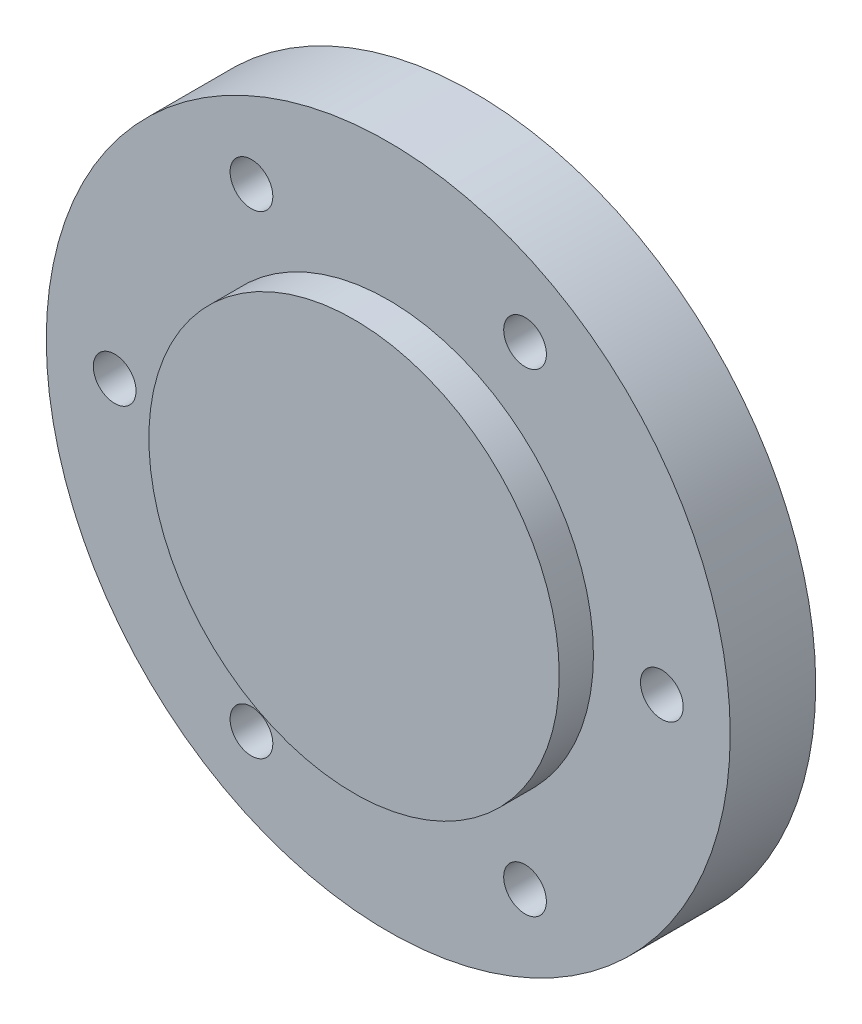
ISO-10303-21;
HEADER;
FILE_DESCRIPTION(('STEP AP214'),'2;1');
FILE_NAME('part.step','',(''),(''),'','','');
FILE_SCHEMA(('AUTOMOTIVE_DESIGN { 1 0 10303 214 1 1 1 1 }'));
ENDSEC;
DATA;
#1=APPLICATION_CONTEXT('core data for automotive mechanical design processes');
#2=APPLICATION_PROTOCOL_DEFINITION('international standard','automotive_design',2000,#1);
#3=PRODUCT_CONTEXT('',#1,'mechanical');
#4=PRODUCT('Part','Part','',(#3));
#5=PRODUCT_RELATED_PRODUCT_CATEGORY('part','',(#4));
#6=PRODUCT_DEFINITION_FORMATION('','',#4);
#7=PRODUCT_DEFINITION_CONTEXT('part definition',#1,'design');
#8=PRODUCT_DEFINITION('design','',#6,#7);
#9=PRODUCT_DEFINITION_SHAPE('','',#8);
#10=(LENGTH_UNIT() NAMED_UNIT(*) SI_UNIT(.MILLI.,.METRE.));
#11=(NAMED_UNIT(*) PLANE_ANGLE_UNIT() SI_UNIT($,.RADIAN.));
#12=(NAMED_UNIT(*) SI_UNIT($,.STERADIAN.) SOLID_ANGLE_UNIT());
#13=UNCERTAINTY_MEASURE_WITH_UNIT(LENGTH_MEASURE(1.E-05),#10,'distance_accuracy_value','');
#14=(GEOMETRIC_REPRESENTATION_CONTEXT(3) GLOBAL_UNCERTAINTY_ASSIGNED_CONTEXT((#13)) GLOBAL_UNIT_ASSIGNED_CONTEXT((#10,
#11,#12)) REPRESENTATION_CONTEXT('',''));
#15=CARTESIAN_POINT('',(0.,0.,0.));
#16=DIRECTION('',(0.,0.,1.));
#17=DIRECTION('',(1.,0.,0.));
#18=AXIS2_PLACEMENT_3D('',#15,#16,#17);
#19=CARTESIAN_POINT('',(0.,0.,5.));
#20=DIRECTION('',(0.,0.,-1.));
#21=DIRECTION('',(-1.,0.,0.));
#22=AXIS2_PLACEMENT_3D('',#19,#20,#21);
#23=CYLINDRICAL_SURFACE('',#22,20.);
#24=CARTESIAN_POINT('',(0.,0.,5.));
#25=DIRECTION('',(0.,0.,1.));
#26=DIRECTION('',(1.,0.,0.));
#27=AXIS2_PLACEMENT_3D('',#24,#25,#26);
#28=CIRCLE('',#27,20.);
#29=CARTESIAN_POINT('',(20.,0.,5.));
#30=VERTEX_POINT('',#29);
#31=EDGE_CURVE('E42',#30,#30,#28,.T.);
#32=ORIENTED_EDGE('',*,*,#31,.F.);
#33=EDGE_LOOP('',(#32));
#34=FACE_BOUND('',#33,.T.);
#35=CARTESIAN_POINT('',(0.,0.,0.));
#36=DIRECTION('',(0.,0.,1.));
#37=DIRECTION('',(1.,0.,0.));
#38=AXIS2_PLACEMENT_3D('',#35,#36,#37);
#39=CIRCLE('',#38,20.);
#40=CARTESIAN_POINT('',(20.,0.,0.));
#41=VERTEX_POINT('',#40);
#42=EDGE_CURVE('E37',#41,#41,#39,.T.);
#43=ORIENTED_EDGE('',*,*,#42,.T.);
#44=EDGE_LOOP('',(#43));
#45=FACE_BOUND('',#44,.T.);
#46=ADVANCED_FACE('F40',(#34,#45),#23,.T.);
#47=CARTESIAN_POINT('',(0.,0.,5.));
#48=DIRECTION('',(0.,0.,1.));
#49=DIRECTION('',(1.,0.,0.));
#50=AXIS2_PLACEMENT_3D('',#47,#48,#49);
#51=PLANE('',#50);
#52=CARTESIAN_POINT('',(7.99999999999999,-13.856406460551,5.));
#53=DIRECTION('',(0.,0.,1.));
#54=DIRECTION('',(0.499999999999999,-0.866025403784439,0.));
#55=AXIS2_PLACEMENT_3D('',#52,#53,#54);
#56=CIRCLE('',#55,1.25);
#57=CARTESIAN_POINT('',(8.62499999999999,-14.9389382152816,5.));
#58=VERTEX_POINT('',#57);
#59=EDGE_CURVE('E66',#58,#58,#56,.T.);
#60=ORIENTED_EDGE('',*,*,#59,.F.);
#61=EDGE_LOOP('',(#60));
#62=FACE_BOUND('',#61,.T.);
#63=CARTESIAN_POINT('',(-8.00000000000001,-13.856406460551,5.));
#64=DIRECTION('',(0.,0.,1.));
#65=DIRECTION('',(-0.5,-0.866025403784438,0.));
#66=AXIS2_PLACEMENT_3D('',#63,#64,#65);
#67=CIRCLE('',#66,1.25);
#68=CARTESIAN_POINT('',(-8.62500000000001,-14.9389382152816,5.));
#69=VERTEX_POINT('',#68);
#70=EDGE_CURVE('E75',#69,#69,#67,.T.);
#71=ORIENTED_EDGE('',*,*,#70,.F.);
#72=EDGE_LOOP('',(#71));
#73=FACE_BOUND('',#72,.T.);
#74=CARTESIAN_POINT('',(-16.,0.,5.));
#75=DIRECTION('',(0.,0.,1.));
#76=DIRECTION('',(-1.,0.,0.));
#77=AXIS2_PLACEMENT_3D('',#74,#75,#76);
#78=CIRCLE('',#77,1.25);
#79=CARTESIAN_POINT('',(-17.25,0.,5.));
#80=VERTEX_POINT('',#79);
#81=EDGE_CURVE('E80',#80,#80,#78,.T.);
#82=ORIENTED_EDGE('',*,*,#81,.F.);
#83=EDGE_LOOP('',(#82));
#84=FACE_BOUND('',#83,.T.);
#85=CARTESIAN_POINT('',(-8.,13.856406460551,5.));
#86=DIRECTION('',(0.,0.,1.));
#87=DIRECTION('',(-0.5,0.866025403784439,0.));
#88=AXIS2_PLACEMENT_3D('',#85,#86,#87);
#89=CIRCLE('',#88,1.25);
#90=CARTESIAN_POINT('',(-8.625,14.9389382152816,5.));
#91=VERTEX_POINT('',#90);
#92=EDGE_CURVE('E83',#91,#91,#89,.T.);
#93=ORIENTED_EDGE('',*,*,#92,.F.);
#94=EDGE_LOOP('',(#93));
#95=FACE_BOUND('',#94,.T.);
#96=CARTESIAN_POINT('',(8.,13.856406460551,5.));
#97=DIRECTION('',(0.,0.,1.));
#98=DIRECTION('',(0.5,0.866025403784439,0.));
#99=AXIS2_PLACEMENT_3D('',#96,#97,#98);
#100=CIRCLE('',#99,1.25);
#101=CARTESIAN_POINT('',(8.625,14.9389382152816,5.));
#102=VERTEX_POINT('',#101);
#103=EDGE_CURVE('E58',#102,#102,#100,.T.);
#104=ORIENTED_EDGE('',*,*,#103,.F.);
#105=EDGE_LOOP('',(#104));
#106=FACE_BOUND('',#105,.T.);
#107=CARTESIAN_POINT('',(16.,0.,5.));
#108=DIRECTION('',(0.,0.,1.));
#109=DIRECTION('',(1.,0.,0.));
#110=AXIS2_PLACEMENT_3D('',#107,#108,#109);
#111=CIRCLE('',#110,1.25);
#112=CARTESIAN_POINT('',(17.25,0.,5.));
#113=VERTEX_POINT('',#112);
#114=EDGE_CURVE('E53',#113,#113,#111,.T.);
#115=ORIENTED_EDGE('',*,*,#114,.F.);
#116=EDGE_LOOP('',(#115));
#117=FACE_BOUND('',#116,.T.);
#118=CARTESIAN_POINT('',(0.,0.,5.));
#119=DIRECTION('',(0.,0.,1.));
#120=DIRECTION('',(1.,0.,0.));
#121=AXIS2_PLACEMENT_3D('',#118,#119,#120);
#122=CIRCLE('',#121,12.);
#123=CARTESIAN_POINT('',(12.,0.,5.));
#124=VERTEX_POINT('',#123);
#125=EDGE_CURVE('E10',#124,#124,#122,.T.);
#126=ORIENTED_EDGE('',*,*,#125,.F.);
#127=EDGE_LOOP('',(#126));
#128=FACE_BOUND('',#127,.T.);
#129=ORIENTED_EDGE('',*,*,#31,.T.);
#130=EDGE_LOOP('',(#129));
#131=FACE_BOUND('',#130,.T.);
#132=ADVANCED_FACE('F101',(#62,#73,#84,#95,#106,#117,#128,#131),#51,.T.);
#133=CARTESIAN_POINT('',(0.,0.,0.));
#134=DIRECTION('',(0.,0.,1.));
#135=DIRECTION('',(1.,0.,0.));
#136=AXIS2_PLACEMENT_3D('',#133,#134,#135);
#137=PLANE('',#136);
#138=CARTESIAN_POINT('',(7.99999999999999,-13.856406460551,0.));
#139=DIRECTION('',(0.,0.,1.));
#140=DIRECTION('',(0.499999999999999,-0.866025403784439,0.));
#141=AXIS2_PLACEMENT_3D('',#138,#139,#140);
#142=CIRCLE('',#141,1.25);
#143=CARTESIAN_POINT('',(8.62499999999999,-14.9389382152816,0.));
#144=VERTEX_POINT('',#143);
#145=EDGE_CURVE('E68',#144,#144,#142,.T.);
#146=ORIENTED_EDGE('',*,*,#145,.T.);
#147=EDGE_LOOP('',(#146));
#148=FACE_BOUND('',#147,.T.);
#149=CARTESIAN_POINT('',(-8.00000000000001,-13.856406460551,0.));
#150=DIRECTION('',(0.,0.,1.));
#151=DIRECTION('',(-0.5,-0.866025403784438,0.));
#152=AXIS2_PLACEMENT_3D('',#149,#150,#151);
#153=CIRCLE('',#152,1.25);
#154=CARTESIAN_POINT('',(-8.62500000000001,-14.9389382152816,0.));
#155=VERTEX_POINT('',#154);
#156=EDGE_CURVE('E73',#155,#155,#153,.T.);
#157=ORIENTED_EDGE('',*,*,#156,.T.);
#158=EDGE_LOOP('',(#157));
#159=FACE_BOUND('',#158,.T.);
#160=CARTESIAN_POINT('',(-16.,0.,0.));
#161=DIRECTION('',(0.,0.,1.));
#162=DIRECTION('',(-1.,0.,0.));
#163=AXIS2_PLACEMENT_3D('',#160,#161,#162);
#164=CIRCLE('',#163,1.25);
#165=CARTESIAN_POINT('',(-17.25,0.,0.));
#166=VERTEX_POINT('',#165);
#167=EDGE_CURVE('E81',#166,#166,#164,.T.);
#168=ORIENTED_EDGE('',*,*,#167,.T.);
#169=EDGE_LOOP('',(#168));
#170=FACE_BOUND('',#169,.T.);
#171=CARTESIAN_POINT('',(-8.,13.856406460551,0.));
#172=DIRECTION('',(0.,0.,1.));
#173=DIRECTION('',(-0.5,0.866025403784439,0.));
#174=AXIS2_PLACEMENT_3D('',#171,#172,#173);
#175=CIRCLE('',#174,1.25);
#176=CARTESIAN_POINT('',(-8.625,14.9389382152816,0.));
#177=VERTEX_POINT('',#176);
#178=EDGE_CURVE('E65',#177,#177,#175,.T.);
#179=ORIENTED_EDGE('',*,*,#178,.T.);
#180=EDGE_LOOP('',(#179));
#181=FACE_BOUND('',#180,.T.);
#182=CARTESIAN_POINT('',(8.,13.856406460551,0.));
#183=DIRECTION('',(0.,0.,1.));
#184=DIRECTION('',(0.5,0.866025403784439,0.));
#185=AXIS2_PLACEMENT_3D('',#182,#183,#184);
#186=CIRCLE('',#185,1.25);
#187=CARTESIAN_POINT('',(8.625,14.9389382152816,0.));
#188=VERTEX_POINT('',#187);
#189=EDGE_CURVE('E60',#188,#188,#186,.T.);
#190=ORIENTED_EDGE('',*,*,#189,.T.);
#191=EDGE_LOOP('',(#190));
#192=FACE_BOUND('',#191,.T.);
#193=CARTESIAN_POINT('',(16.,0.,0.));
#194=DIRECTION('',(0.,0.,1.));
#195=DIRECTION('',(1.,0.,0.));
#196=AXIS2_PLACEMENT_3D('',#193,#194,#195);
#197=CIRCLE('',#196,1.25);
#198=CARTESIAN_POINT('',(17.25,0.,0.));
#199=VERTEX_POINT('',#198);
#200=EDGE_CURVE('E52',#199,#199,#197,.T.);
#201=ORIENTED_EDGE('',*,*,#200,.T.);
#202=EDGE_LOOP('',(#201));
#203=FACE_BOUND('',#202,.T.);
#204=ORIENTED_EDGE('',*,*,#42,.F.);
#205=EDGE_LOOP('',(#204));
#206=FACE_BOUND('',#205,.T.);
#207=ADVANCED_FACE('F89',(#148,#159,#170,#181,#192,#203,#206),#137,.F.);
#208=CARTESIAN_POINT('',(0.,0.,7.));
#209=DIRECTION('',(0.,0.,-1.));
#210=DIRECTION('',(-1.,0.,0.));
#211=AXIS2_PLACEMENT_3D('',#208,#209,#210);
#212=CYLINDRICAL_SURFACE('',#211,12.);
#213=CARTESIAN_POINT('',(0.,0.,7.));
#214=DIRECTION('',(0.,0.,1.));
#215=DIRECTION('',(1.,0.,0.));
#216=AXIS2_PLACEMENT_3D('',#213,#214,#215);
#217=CIRCLE('',#216,12.);
#218=CARTESIAN_POINT('',(12.,0.,7.));
#219=VERTEX_POINT('',#218);
#220=EDGE_CURVE('E49',#219,#219,#217,.T.);
#221=ORIENTED_EDGE('',*,*,#220,.F.);
#222=EDGE_LOOP('',(#221));
#223=FACE_BOUND('',#222,.T.);
#224=ORIENTED_EDGE('',*,*,#125,.T.);
#225=EDGE_LOOP('',(#224));
#226=FACE_BOUND('',#225,.T.);
#227=ADVANCED_FACE('F118',(#223,#226),#212,.T.);
#228=CARTESIAN_POINT('',(0.,0.,7.));
#229=DIRECTION('',(0.,0.,1.));
#230=DIRECTION('',(1.,0.,0.));
#231=AXIS2_PLACEMENT_3D('',#228,#229,#230);
#232=PLANE('',#231);
#233=ORIENTED_EDGE('',*,*,#220,.T.);
#234=EDGE_LOOP('',(#233));
#235=FACE_BOUND('',#234,.T.);
#236=ADVANCED_FACE('F125',(#235),#232,.T.);
#237=CARTESIAN_POINT('',(16.,0.,0.));
#238=DIRECTION('',(0.,0.,1.));
#239=DIRECTION('',(1.,0.,0.));
#240=AXIS2_PLACEMENT_3D('',#237,#238,#239);
#241=CYLINDRICAL_SURFACE('',#240,1.25);
#242=ORIENTED_EDGE('',*,*,#200,.F.);
#243=EDGE_LOOP('',(#242));
#244=FACE_BOUND('',#243,.T.);
#245=ORIENTED_EDGE('',*,*,#114,.T.);
#246=EDGE_LOOP('',(#245));
#247=FACE_BOUND('',#246,.T.);
#248=ADVANCED_FACE('F131',(#244,#247),#241,.F.);
#249=CARTESIAN_POINT('',(8.,13.856406460551,0.));
#250=DIRECTION('',(0.,0.,1.));
#251=DIRECTION('',(1.,0.,0.));
#252=AXIS2_PLACEMENT_3D('',#249,#250,#251);
#253=CYLINDRICAL_SURFACE('',#252,1.25);
#254=ORIENTED_EDGE('',*,*,#189,.F.);
#255=EDGE_LOOP('',(#254));
#256=FACE_BOUND('',#255,.T.);
#257=ORIENTED_EDGE('',*,*,#103,.T.);
#258=EDGE_LOOP('',(#257));
#259=FACE_BOUND('',#258,.T.);
#260=ADVANCED_FACE('F100',(#256,#259),#253,.F.);
#261=CARTESIAN_POINT('',(-8.,13.856406460551,0.));
#262=DIRECTION('',(0.,0.,1.));
#263=DIRECTION('',(1.,0.,0.));
#264=AXIS2_PLACEMENT_3D('',#261,#262,#263);
#265=CYLINDRICAL_SURFACE('',#264,1.25);
#266=ORIENTED_EDGE('',*,*,#178,.F.);
#267=EDGE_LOOP('',(#266));
#268=FACE_BOUND('',#267,.T.);
#269=ORIENTED_EDGE('',*,*,#92,.T.);
#270=EDGE_LOOP('',(#269));
#271=FACE_BOUND('',#270,.T.);
#272=ADVANCED_FACE('F91',(#268,#271),#265,.F.);
#273=CARTESIAN_POINT('',(-16.,0.,0.));
#274=DIRECTION('',(0.,0.,1.));
#275=DIRECTION('',(1.,0.,0.));
#276=AXIS2_PLACEMENT_3D('',#273,#274,#275);
#277=CYLINDRICAL_SURFACE('',#276,1.25);
#278=ORIENTED_EDGE('',*,*,#167,.F.);
#279=EDGE_LOOP('',(#278));
#280=FACE_BOUND('',#279,.T.);
#281=ORIENTED_EDGE('',*,*,#81,.T.);
#282=EDGE_LOOP('',(#281));
#283=FACE_BOUND('',#282,.T.);
#284=ADVANCED_FACE('F96',(#280,#283),#277,.F.);
#285=CARTESIAN_POINT('',(-8.00000000000001,-13.856406460551,0.));
#286=DIRECTION('',(0.,0.,1.));
#287=DIRECTION('',(1.,0.,0.));
#288=AXIS2_PLACEMENT_3D('',#285,#286,#287);
#289=CYLINDRICAL_SURFACE('',#288,1.25);
#290=ORIENTED_EDGE('',*,*,#156,.F.);
#291=EDGE_LOOP('',(#290));
#292=FACE_BOUND('',#291,.T.);
#293=ORIENTED_EDGE('',*,*,#70,.T.);
#294=EDGE_LOOP('',(#293));
#295=FACE_BOUND('',#294,.T.);
#296=ADVANCED_FACE('F142',(#292,#295),#289,.F.);
#297=CARTESIAN_POINT('',(7.99999999999999,-13.856406460551,0.));
#298=DIRECTION('',(0.,0.,1.));
#299=DIRECTION('',(1.,0.,0.));
#300=AXIS2_PLACEMENT_3D('',#297,#298,#299);
#301=CYLINDRICAL_SURFACE('',#300,1.25);
#302=ORIENTED_EDGE('',*,*,#145,.F.);
#303=EDGE_LOOP('',(#302));
#304=FACE_BOUND('',#303,.T.);
#305=ORIENTED_EDGE('',*,*,#59,.T.);
#306=EDGE_LOOP('',(#305));
#307=FACE_BOUND('',#306,.T.);
#308=ADVANCED_FACE('F138',(#304,#307),#301,.F.);
#309=CLOSED_SHELL('',(#46,#132,#207,#227,#236,#248,#260,#272,#284,#296,#308));
#310=MANIFOLD_SOLID_BREP('B2',#309);
#311=ADVANCED_BREP_SHAPE_REPRESENTATION('',(#18,#310),#14);
#312=SHAPE_DEFINITION_REPRESENTATION(#9,#311);
ENDSEC;
END-ISO-10303-21;
